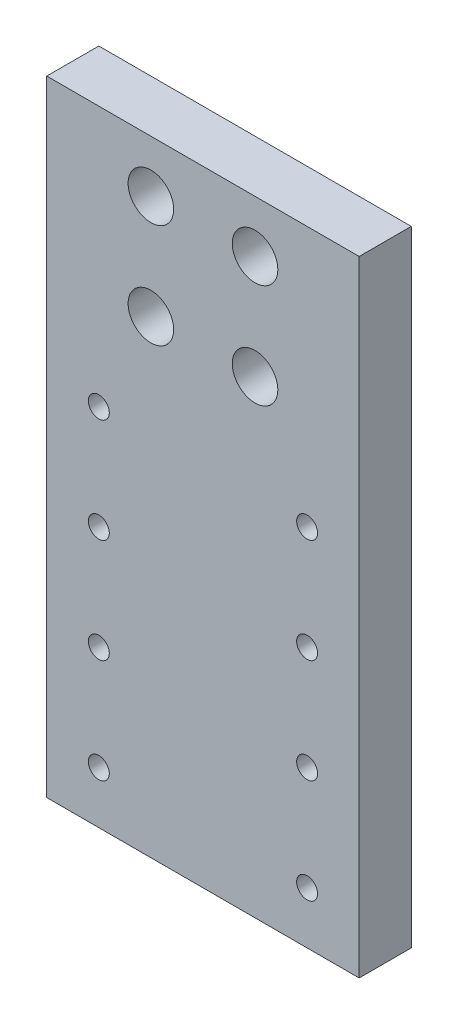
ISO-10303-21;
HEADER;
FILE_DESCRIPTION(('STEP AP214'),'2;1');
FILE_NAME('part.step','',(''),(''),'','','');
FILE_SCHEMA(('AUTOMOTIVE_DESIGN { 1 0 10303 214 1 1 1 1 }'));
ENDSEC;
DATA;
#1=APPLICATION_CONTEXT('core data for automotive mechanical design processes');
#2=APPLICATION_PROTOCOL_DEFINITION('international standard','automotive_design',2000,#1);
#3=PRODUCT_CONTEXT('',#1,'mechanical');
#4=PRODUCT('Part','Part','',(#3));
#5=PRODUCT_RELATED_PRODUCT_CATEGORY('part','',(#4));
#6=PRODUCT_DEFINITION_FORMATION('','',#4);
#7=PRODUCT_DEFINITION_CONTEXT('part definition',#1,'design');
#8=PRODUCT_DEFINITION('design','',#6,#7);
#9=PRODUCT_DEFINITION_SHAPE('','',#8);
#10=(LENGTH_UNIT() NAMED_UNIT(*) SI_UNIT(.MILLI.,.METRE.));
#11=(NAMED_UNIT(*) PLANE_ANGLE_UNIT() SI_UNIT($,.RADIAN.));
#12=(NAMED_UNIT(*) SI_UNIT($,.STERADIAN.) SOLID_ANGLE_UNIT());
#13=UNCERTAINTY_MEASURE_WITH_UNIT(LENGTH_MEASURE(1.E-05),#10,'distance_accuracy_value','');
#14=(GEOMETRIC_REPRESENTATION_CONTEXT(3) GLOBAL_UNCERTAINTY_ASSIGNED_CONTEXT((#13)) GLOBAL_UNIT_ASSIGNED_CONTEXT((#10,
#11,#12)) REPRESENTATION_CONTEXT('',''));
#15=CARTESIAN_POINT('',(0.,0.,0.));
#16=DIRECTION('',(0.,0.,1.));
#17=DIRECTION('',(1.,0.,0.));
#18=AXIS2_PLACEMENT_3D('',#15,#16,#17);
#19=CARTESIAN_POINT('',(38.1000000000001,-127.,12.7));
#20=DIRECTION('',(-1.,0.,0.));
#21=DIRECTION('',(0.,-1.,0.));
#22=AXIS2_PLACEMENT_3D('',#19,#20,#21);
#23=PLANE('',#22);
#24=DIRECTION('',(0.,1.,0.));
#25=VECTOR('',#24,1.);
#26=CARTESIAN_POINT('',(38.1000000000001,-127.,0.));
#27=LINE('',#26,#25);
#28=CARTESIAN_POINT('',(38.1000000000001,-127.,0.));
#29=VERTEX_POINT('',#28);
#30=CARTESIAN_POINT('',(38.1,25.4,0.));
#31=VERTEX_POINT('',#30);
#32=EDGE_CURVE('E95',#29,#31,#27,.T.);
#33=ORIENTED_EDGE('',*,*,#32,.T.);
#34=DIRECTION('',(0.,0.,-1.));
#35=VECTOR('',#34,1.);
#36=CARTESIAN_POINT('',(38.1,25.4,12.7));
#37=LINE('',#36,#35);
#38=CARTESIAN_POINT('',(38.1,25.4,12.7));
#39=VERTEX_POINT('',#38);
#40=EDGE_CURVE('E11',#39,#31,#37,.T.);
#41=ORIENTED_EDGE('',*,*,#40,.F.);
#42=DIRECTION('',(0.,1.,0.));
#43=VECTOR('',#42,1.);
#44=CARTESIAN_POINT('',(38.1000000000001,-127.,12.7));
#45=LINE('',#44,#43);
#46=CARTESIAN_POINT('',(38.1000000000001,-127.,12.7));
#47=VERTEX_POINT('',#46);
#48=EDGE_CURVE('E83',#47,#39,#45,.T.);
#49=ORIENTED_EDGE('',*,*,#48,.F.);
#50=DIRECTION('',(0.,0.,-1.));
#51=VECTOR('',#50,1.);
#52=CARTESIAN_POINT('',(38.1000000000001,-127.,12.7));
#53=LINE('',#52,#51);
#54=EDGE_CURVE('E91',#47,#29,#53,.T.);
#55=ORIENTED_EDGE('',*,*,#54,.T.);
#56=EDGE_LOOP('',(#33,#41,#49,#55));
#57=FACE_BOUND('',#56,.T.);
#58=ADVANCED_FACE('F32',(#57),#23,.F.);
#59=CARTESIAN_POINT('',(-38.1,25.4,12.7));
#60=DIRECTION('',(0.,-1.,0.));
#61=DIRECTION('',(1.,0.,0.));
#62=AXIS2_PLACEMENT_3D('',#59,#60,#61);
#63=PLANE('',#62);
#64=DIRECTION('',(-1.,0.,0.));
#65=VECTOR('',#64,1.);
#66=CARTESIAN_POINT('',(-38.1,25.4,0.));
#67=LINE('',#66,#65);
#68=CARTESIAN_POINT('',(-38.1,25.4,0.));
#69=VERTEX_POINT('',#68);
#70=EDGE_CURVE('E87',#31,#69,#67,.T.);
#71=ORIENTED_EDGE('',*,*,#70,.T.);
#72=DIRECTION('',(0.,0.,-1.));
#73=VECTOR('',#72,1.);
#74=CARTESIAN_POINT('',(-38.1,25.4,12.7));
#75=LINE('',#74,#73);
#76=CARTESIAN_POINT('',(-38.1,25.4,12.7));
#77=VERTEX_POINT('',#76);
#78=EDGE_CURVE('E40',#77,#69,#75,.T.);
#79=ORIENTED_EDGE('',*,*,#78,.F.);
#80=DIRECTION('',(-1.,0.,0.));
#81=VECTOR('',#80,1.);
#82=CARTESIAN_POINT('',(-38.1,25.4,12.7));
#83=LINE('',#82,#81);
#84=EDGE_CURVE('E78',#39,#77,#83,.T.);
#85=ORIENTED_EDGE('',*,*,#84,.F.);
#86=ORIENTED_EDGE('',*,*,#40,.T.);
#87=EDGE_LOOP('',(#71,#79,#85,#86));
#88=FACE_BOUND('',#87,.T.);
#89=ADVANCED_FACE('F86',(#88),#63,.F.);
#90=CARTESIAN_POINT('',(-38.1,-127.,12.7));
#91=DIRECTION('',(1.,0.,0.));
#92=DIRECTION('',(0.,1.,0.));
#93=AXIS2_PLACEMENT_3D('',#90,#91,#92);
#94=PLANE('',#93);
#95=DIRECTION('',(0.,-1.,0.));
#96=VECTOR('',#95,1.);
#97=CARTESIAN_POINT('',(-38.1,-127.,0.));
#98=LINE('',#97,#96);
#99=CARTESIAN_POINT('',(-38.1,-127.,0.));
#100=VERTEX_POINT('',#99);
#101=EDGE_CURVE('E65',#69,#100,#98,.T.);
#102=ORIENTED_EDGE('',*,*,#101,.T.);
#103=DIRECTION('',(0.,0.,-1.));
#104=VECTOR('',#103,1.);
#105=CARTESIAN_POINT('',(-38.1,-127.,12.7));
#106=LINE('',#105,#104);
#107=CARTESIAN_POINT('',(-38.1,-127.,12.7));
#108=VERTEX_POINT('',#107);
#109=EDGE_CURVE('E88',#108,#100,#106,.T.);
#110=ORIENTED_EDGE('',*,*,#109,.F.);
#111=DIRECTION('',(0.,-1.,0.));
#112=VECTOR('',#111,1.);
#113=CARTESIAN_POINT('',(-38.1,-127.,12.7));
#114=LINE('',#113,#112);
#115=EDGE_CURVE('E81',#77,#108,#114,.T.);
#116=ORIENTED_EDGE('',*,*,#115,.F.);
#117=ORIENTED_EDGE('',*,*,#78,.T.);
#118=EDGE_LOOP('',(#102,#110,#116,#117));
#119=FACE_BOUND('',#118,.T.);
#120=ADVANCED_FACE('F89',(#119),#94,.F.);
#121=CARTESIAN_POINT('',(-38.1,-127.,12.7));
#122=DIRECTION('',(0.,1.,0.));
#123=DIRECTION('',(-1.,0.,0.));
#124=AXIS2_PLACEMENT_3D('',#121,#122,#123);
#125=PLANE('',#124);
#126=DIRECTION('',(1.,0.,0.));
#127=VECTOR('',#126,1.);
#128=CARTESIAN_POINT('',(-38.1,-127.,0.));
#129=LINE('',#128,#127);
#130=EDGE_CURVE('E71',#100,#29,#129,.T.);
#131=ORIENTED_EDGE('',*,*,#130,.T.);
#132=ORIENTED_EDGE('',*,*,#54,.F.);
#133=DIRECTION('',(1.,0.,0.));
#134=VECTOR('',#133,1.);
#135=CARTESIAN_POINT('',(-38.1,-127.,12.7));
#136=LINE('',#135,#134);
#137=EDGE_CURVE('E48',#108,#47,#136,.T.);
#138=ORIENTED_EDGE('',*,*,#137,.F.);
#139=ORIENTED_EDGE('',*,*,#109,.T.);
#140=EDGE_LOOP('',(#131,#132,#138,#139));
#141=FACE_BOUND('',#140,.T.);
#142=ADVANCED_FACE('F103',(#141),#125,.F.);
#143=CARTESIAN_POINT('',(0.,0.,12.7));
#144=DIRECTION('',(0.,0.,-1.));
#145=DIRECTION('',(-1.,0.,0.));
#146=AXIS2_PLACEMENT_3D('',#143,#144,#145);
#147=PLANE('',#146);
#148=CARTESIAN_POINT('',(25.4000000000001,-114.3,12.7));
#149=DIRECTION('',(0.,0.,-1.));
#150=DIRECTION('',(-1.,0.,0.));
#151=AXIS2_PLACEMENT_3D('',#148,#149,#150);
#152=CIRCLE('',#151,2.55270000000001);
#153=CARTESIAN_POINT('',(22.8473000000001,-114.3,12.7));
#154=VERTEX_POINT('',#153);
#155=EDGE_CURVE('E240',#154,#154,#152,.T.);
#156=ORIENTED_EDGE('',*,*,#155,.T.);
#157=EDGE_LOOP('',(#156));
#158=FACE_BOUND('',#157,.T.);
#159=CARTESIAN_POINT('',(-25.3999999999999,-114.3,12.7));
#160=DIRECTION('',(0.,0.,-1.));
#161=DIRECTION('',(-1.,0.,0.));
#162=AXIS2_PLACEMENT_3D('',#159,#160,#161);
#163=CIRCLE('',#162,2.55270000000001);
#164=CARTESIAN_POINT('',(-27.9526999999999,-114.3,12.7));
#165=VERTEX_POINT('',#164);
#166=EDGE_CURVE('E228',#165,#165,#163,.T.);
#167=ORIENTED_EDGE('',*,*,#166,.T.);
#168=EDGE_LOOP('',(#167));
#169=FACE_BOUND('',#168,.T.);
#170=CARTESIAN_POINT('',(-25.3999999999998,-88.9,12.7));
#171=DIRECTION('',(0.,0.,-1.));
#172=DIRECTION('',(-1.,0.,0.));
#173=AXIS2_PLACEMENT_3D('',#170,#171,#172);
#174=CIRCLE('',#173,2.55270000000001);
#175=CARTESIAN_POINT('',(-27.9526999999998,-88.9,12.7));
#176=VERTEX_POINT('',#175);
#177=EDGE_CURVE('E216',#176,#176,#174,.T.);
#178=ORIENTED_EDGE('',*,*,#177,.T.);
#179=EDGE_LOOP('',(#178));
#180=FACE_BOUND('',#179,.T.);
#181=CARTESIAN_POINT('',(-25.3999999999997,-63.5,12.7));
#182=DIRECTION('',(0.,0.,-1.));
#183=DIRECTION('',(-1.,0.,0.));
#184=AXIS2_PLACEMENT_3D('',#181,#182,#183);
#185=CIRCLE('',#184,2.55270000000001);
#186=CARTESIAN_POINT('',(-27.9526999999997,-63.5,12.7));
#187=VERTEX_POINT('',#186);
#188=EDGE_CURVE('E204',#187,#187,#185,.T.);
#189=ORIENTED_EDGE('',*,*,#188,.T.);
#190=EDGE_LOOP('',(#189));
#191=FACE_BOUND('',#190,.T.);
#192=CARTESIAN_POINT('',(-25.3999999999997,-38.1,12.7));
#193=DIRECTION('',(0.,0.,-1.));
#194=DIRECTION('',(-1.,0.,0.));
#195=AXIS2_PLACEMENT_3D('',#192,#193,#194);
#196=CIRCLE('',#195,2.55270000000001);
#197=CARTESIAN_POINT('',(-27.9526999999997,-38.1,12.7));
#198=VERTEX_POINT('',#197);
#199=EDGE_CURVE('E192',#198,#198,#196,.T.);
#200=ORIENTED_EDGE('',*,*,#199,.T.);
#201=EDGE_LOOP('',(#200));
#202=FACE_BOUND('',#201,.T.);
#203=CARTESIAN_POINT('',(25.4000000000002,-88.9,12.7));
#204=DIRECTION('',(0.,0.,-1.));
#205=DIRECTION('',(-1.,0.,0.));
#206=AXIS2_PLACEMENT_3D('',#203,#204,#205);
#207=CIRCLE('',#206,2.55270000000001);
#208=CARTESIAN_POINT('',(22.8473000000002,-88.9,12.7));
#209=VERTEX_POINT('',#208);
#210=EDGE_CURVE('E180',#209,#209,#207,.T.);
#211=ORIENTED_EDGE('',*,*,#210,.T.);
#212=EDGE_LOOP('',(#211));
#213=FACE_BOUND('',#212,.T.);
#214=CARTESIAN_POINT('',(25.4000000000003,-63.5,12.7));
#215=DIRECTION('',(0.,0.,-1.));
#216=DIRECTION('',(-1.,0.,0.));
#217=AXIS2_PLACEMENT_3D('',#214,#215,#216);
#218=CIRCLE('',#217,2.55270000000001);
#219=CARTESIAN_POINT('',(22.8473000000002,-63.5,12.7));
#220=VERTEX_POINT('',#219);
#221=EDGE_CURVE('E168',#220,#220,#218,.T.);
#222=ORIENTED_EDGE('',*,*,#221,.T.);
#223=EDGE_LOOP('',(#222));
#224=FACE_BOUND('',#223,.T.);
#225=CARTESIAN_POINT('',(25.4000000000004,-38.1,12.7));
#226=DIRECTION('',(0.,0.,-1.));
#227=DIRECTION('',(-1.,0.,0.));
#228=AXIS2_PLACEMENT_3D('',#225,#226,#227);
#229=CIRCLE('',#228,2.55270000000001);
#230=CARTESIAN_POINT('',(22.8473000000003,-38.1,12.7));
#231=VERTEX_POINT('',#230);
#232=EDGE_CURVE('E156',#231,#231,#229,.T.);
#233=ORIENTED_EDGE('',*,*,#232,.T.);
#234=EDGE_LOOP('',(#233));
#235=FACE_BOUND('',#234,.T.);
#236=CARTESIAN_POINT('',(-12.7,12.7,12.7));
#237=DIRECTION('',(0.,0.,1.));
#238=DIRECTION('',(1.,0.,0.));
#239=AXIS2_PLACEMENT_3D('',#236,#237,#238);
#240=CIRCLE('',#239,5.55625);
#241=CARTESIAN_POINT('',(-7.14375,12.7,12.7));
#242=VERTEX_POINT('',#241);
#243=EDGE_CURVE('E153',#242,#242,#240,.T.);
#244=ORIENTED_EDGE('',*,*,#243,.F.);
#245=EDGE_LOOP('',(#244));
#246=FACE_BOUND('',#245,.T.);
#247=CARTESIAN_POINT('',(-12.7,-12.7,12.7));
#248=DIRECTION('',(0.,0.,1.));
#249=DIRECTION('',(1.,0.,0.));
#250=AXIS2_PLACEMENT_3D('',#247,#248,#249);
#251=CIRCLE('',#250,5.55625);
#252=CARTESIAN_POINT('',(-7.14375,-12.7,12.7));
#253=VERTEX_POINT('',#252);
#254=EDGE_CURVE('E141',#253,#253,#251,.T.);
#255=ORIENTED_EDGE('',*,*,#254,.F.);
#256=EDGE_LOOP('',(#255));
#257=FACE_BOUND('',#256,.T.);
#258=CARTESIAN_POINT('',(12.7,-12.7,12.7));
#259=DIRECTION('',(0.,0.,1.));
#260=DIRECTION('',(1.,0.,0.));
#261=AXIS2_PLACEMENT_3D('',#258,#259,#260);
#262=CIRCLE('',#261,5.55625);
#263=CARTESIAN_POINT('',(18.25625,-12.7,12.7));
#264=VERTEX_POINT('',#263);
#265=EDGE_CURVE('E129',#264,#264,#262,.T.);
#266=ORIENTED_EDGE('',*,*,#265,.F.);
#267=EDGE_LOOP('',(#266));
#268=FACE_BOUND('',#267,.T.);
#269=CARTESIAN_POINT('',(12.7,12.7,12.7));
#270=DIRECTION('',(0.,0.,1.));
#271=DIRECTION('',(1.,0.,0.));
#272=AXIS2_PLACEMENT_3D('',#269,#270,#271);
#273=CIRCLE('',#272,5.55625);
#274=CARTESIAN_POINT('',(18.25625,12.7,12.7));
#275=VERTEX_POINT('',#274);
#276=EDGE_CURVE('E117',#275,#275,#273,.T.);
#277=ORIENTED_EDGE('',*,*,#276,.F.);
#278=EDGE_LOOP('',(#277));
#279=FACE_BOUND('',#278,.T.);
#280=ORIENTED_EDGE('',*,*,#48,.T.);
#281=ORIENTED_EDGE('',*,*,#84,.T.);
#282=ORIENTED_EDGE('',*,*,#115,.T.);
#283=ORIENTED_EDGE('',*,*,#137,.T.);
#284=EDGE_LOOP('',(#280,#281,#282,#283));
#285=FACE_BOUND('',#284,.T.);
#286=ADVANCED_FACE('F79',(#158,#169,#180,#191,#202,#213,#224,#235,#246,#257,#268,#279,#285),
#147,.F.);
#287=CARTESIAN_POINT('',(0.,0.,0.));
#288=DIRECTION('',(0.,0.,-1.));
#289=DIRECTION('',(-1.,0.,0.));
#290=AXIS2_PLACEMENT_3D('',#287,#288,#289);
#291=PLANE('',#290);
#292=CARTESIAN_POINT('',(25.4000000000001,-114.3,0.));
#293=DIRECTION('',(0.,0.,-1.));
#294=DIRECTION('',(-1.,0.,0.));
#295=AXIS2_PLACEMENT_3D('',#292,#293,#294);
#296=CIRCLE('',#295,4.7625);
#297=CARTESIAN_POINT('',(20.6375000000001,-114.3,0.));
#298=VERTEX_POINT('',#297);
#299=EDGE_CURVE('E249',#298,#298,#296,.T.);
#300=ORIENTED_EDGE('',*,*,#299,.F.);
#301=EDGE_LOOP('',(#300));
#302=FACE_BOUND('',#301,.T.);
#303=CARTESIAN_POINT('',(-25.3999999999999,-114.3,0.));
#304=DIRECTION('',(0.,0.,-1.));
#305=DIRECTION('',(-1.,0.,0.));
#306=AXIS2_PLACEMENT_3D('',#303,#304,#305);
#307=CIRCLE('',#306,4.7625);
#308=CARTESIAN_POINT('',(-30.1624999999999,-114.3,0.));
#309=VERTEX_POINT('',#308);
#310=EDGE_CURVE('E237',#309,#309,#307,.T.);
#311=ORIENTED_EDGE('',*,*,#310,.F.);
#312=EDGE_LOOP('',(#311));
#313=FACE_BOUND('',#312,.T.);
#314=CARTESIAN_POINT('',(-25.3999999999998,-88.9,0.));
#315=DIRECTION('',(0.,0.,-1.));
#316=DIRECTION('',(-1.,0.,0.));
#317=AXIS2_PLACEMENT_3D('',#314,#315,#316);
#318=CIRCLE('',#317,4.7625);
#319=CARTESIAN_POINT('',(-30.1624999999998,-88.9,0.));
#320=VERTEX_POINT('',#319);
#321=EDGE_CURVE('E225',#320,#320,#318,.T.);
#322=ORIENTED_EDGE('',*,*,#321,.F.);
#323=EDGE_LOOP('',(#322));
#324=FACE_BOUND('',#323,.T.);
#325=CARTESIAN_POINT('',(-25.3999999999997,-63.5,0.));
#326=DIRECTION('',(0.,0.,-1.));
#327=DIRECTION('',(-1.,0.,0.));
#328=AXIS2_PLACEMENT_3D('',#325,#326,#327);
#329=CIRCLE('',#328,4.7625);
#330=CARTESIAN_POINT('',(-30.1624999999997,-63.5,0.));
#331=VERTEX_POINT('',#330);
#332=EDGE_CURVE('E213',#331,#331,#329,.T.);
#333=ORIENTED_EDGE('',*,*,#332,.F.);
#334=EDGE_LOOP('',(#333));
#335=FACE_BOUND('',#334,.T.);
#336=CARTESIAN_POINT('',(-25.3999999999997,-38.1,0.));
#337=DIRECTION('',(0.,0.,-1.));
#338=DIRECTION('',(-1.,0.,0.));
#339=AXIS2_PLACEMENT_3D('',#336,#337,#338);
#340=CIRCLE('',#339,4.7625);
#341=CARTESIAN_POINT('',(-30.1624999999996,-38.1,0.));
#342=VERTEX_POINT('',#341);
#343=EDGE_CURVE('E201',#342,#342,#340,.T.);
#344=ORIENTED_EDGE('',*,*,#343,.F.);
#345=EDGE_LOOP('',(#344));
#346=FACE_BOUND('',#345,.T.);
#347=CARTESIAN_POINT('',(25.4000000000002,-88.9,0.));
#348=DIRECTION('',(0.,0.,-1.));
#349=DIRECTION('',(-1.,0.,0.));
#350=AXIS2_PLACEMENT_3D('',#347,#348,#349);
#351=CIRCLE('',#350,4.7625);
#352=CARTESIAN_POINT('',(20.6375000000002,-88.9,0.));
#353=VERTEX_POINT('',#352);
#354=EDGE_CURVE('E189',#353,#353,#351,.T.);
#355=ORIENTED_EDGE('',*,*,#354,.F.);
#356=EDGE_LOOP('',(#355));
#357=FACE_BOUND('',#356,.T.);
#358=CARTESIAN_POINT('',(25.4000000000003,-63.5,0.));
#359=DIRECTION('',(0.,0.,-1.));
#360=DIRECTION('',(-1.,0.,0.));
#361=AXIS2_PLACEMENT_3D('',#358,#359,#360);
#362=CIRCLE('',#361,4.7625);
#363=CARTESIAN_POINT('',(20.6375000000003,-63.5,0.));
#364=VERTEX_POINT('',#363);
#365=EDGE_CURVE('E177',#364,#364,#362,.T.);
#366=ORIENTED_EDGE('',*,*,#365,.F.);
#367=EDGE_LOOP('',(#366));
#368=FACE_BOUND('',#367,.T.);
#369=CARTESIAN_POINT('',(25.4000000000004,-38.1,0.));
#370=DIRECTION('',(0.,0.,-1.));
#371=DIRECTION('',(-1.,0.,0.));
#372=AXIS2_PLACEMENT_3D('',#369,#370,#371);
#373=CIRCLE('',#372,4.7625);
#374=CARTESIAN_POINT('',(20.6375000000004,-38.1,0.));
#375=VERTEX_POINT('',#374);
#376=EDGE_CURVE('E165',#375,#375,#373,.T.);
#377=ORIENTED_EDGE('',*,*,#376,.F.);
#378=EDGE_LOOP('',(#377));
#379=FACE_BOUND('',#378,.T.);
#380=CARTESIAN_POINT('',(-12.7,12.7,0.));
#381=DIRECTION('',(0.,0.,1.));
#382=DIRECTION('',(1.,0.,0.));
#383=AXIS2_PLACEMENT_3D('',#380,#381,#382);
#384=CIRCLE('',#383,3.37820000000001);
#385=CARTESIAN_POINT('',(-9.32179999999999,12.7,0.));
#386=VERTEX_POINT('',#385);
#387=EDGE_CURVE('E144',#386,#386,#384,.T.);
#388=ORIENTED_EDGE('',*,*,#387,.T.);
#389=EDGE_LOOP('',(#388));
#390=FACE_BOUND('',#389,.T.);
#391=CARTESIAN_POINT('',(-12.7,-12.7,0.));
#392=DIRECTION('',(0.,0.,1.));
#393=DIRECTION('',(1.,0.,0.));
#394=AXIS2_PLACEMENT_3D('',#391,#392,#393);
#395=CIRCLE('',#394,3.37820000000001);
#396=CARTESIAN_POINT('',(-9.32179999999999,-12.7,0.));
#397=VERTEX_POINT('',#396);
#398=EDGE_CURVE('E132',#397,#397,#395,.T.);
#399=ORIENTED_EDGE('',*,*,#398,.T.);
#400=EDGE_LOOP('',(#399));
#401=FACE_BOUND('',#400,.T.);
#402=CARTESIAN_POINT('',(12.7,-12.7,0.));
#403=DIRECTION('',(0.,0.,1.));
#404=DIRECTION('',(1.,0.,0.));
#405=AXIS2_PLACEMENT_3D('',#402,#403,#404);
#406=CIRCLE('',#405,3.37820000000001);
#407=CARTESIAN_POINT('',(16.0782,-12.7,0.));
#408=VERTEX_POINT('',#407);
#409=EDGE_CURVE('E120',#408,#408,#406,.T.);
#410=ORIENTED_EDGE('',*,*,#409,.T.);
#411=EDGE_LOOP('',(#410));
#412=FACE_BOUND('',#411,.T.);
#413=CARTESIAN_POINT('',(12.7,12.7,0.));
#414=DIRECTION('',(0.,0.,1.));
#415=DIRECTION('',(1.,0.,0.));
#416=AXIS2_PLACEMENT_3D('',#413,#414,#415);
#417=CIRCLE('',#416,3.37820000000001);
#418=CARTESIAN_POINT('',(16.0782,12.7,0.));
#419=VERTEX_POINT('',#418);
#420=EDGE_CURVE('E98',#419,#419,#417,.T.);
#421=ORIENTED_EDGE('',*,*,#420,.T.);
#422=EDGE_LOOP('',(#421));
#423=FACE_BOUND('',#422,.T.);
#424=ORIENTED_EDGE('',*,*,#32,.F.);
#425=ORIENTED_EDGE('',*,*,#130,.F.);
#426=ORIENTED_EDGE('',*,*,#101,.F.);
#427=ORIENTED_EDGE('',*,*,#70,.F.);
#428=EDGE_LOOP('',(#424,#425,#426,#427));
#429=FACE_BOUND('',#428,.T.);
#430=ADVANCED_FACE('F106',(#302,#313,#324,#335,#346,#357,#368,#379,#390,#401,#412,#423,#429),
#291,.T.);
#431=CARTESIAN_POINT('',(12.7,12.7,12.7));
#432=DIRECTION('',(0.,0.,1.));
#433=DIRECTION('',(1.,0.,0.));
#434=AXIS2_PLACEMENT_3D('',#431,#432,#433);
#435=CYLINDRICAL_SURFACE('',#434,3.3782);
#436=ORIENTED_EDGE('',*,*,#420,.F.);
#437=EDGE_LOOP('',(#436));
#438=FACE_BOUND('',#437,.T.);
#439=CARTESIAN_POINT('',(12.7,12.7,3.81));
#440=DIRECTION('',(0.,0.,1.));
#441=DIRECTION('',(1.,0.,0.));
#442=AXIS2_PLACEMENT_3D('',#439,#440,#441);
#443=CIRCLE('',#442,3.3782);
#444=CARTESIAN_POINT('',(16.0782,12.7,3.81));
#445=VERTEX_POINT('',#444);
#446=EDGE_CURVE('E111',#445,#445,#443,.T.);
#447=ORIENTED_EDGE('',*,*,#446,.T.);
#448=EDGE_LOOP('',(#447));
#449=FACE_BOUND('',#448,.T.);
#450=ADVANCED_FACE('F257',(#438,#449),#435,.F.);
#451=CARTESIAN_POINT('',(16.0782,12.7,3.81));
#452=DIRECTION('',(0.,0.,-1.));
#453=DIRECTION('',(-1.,0.,0.));
#454=AXIS2_PLACEMENT_3D('',#451,#452,#453);
#455=PLANE('',#454);
#456=ORIENTED_EDGE('',*,*,#446,.F.);
#457=EDGE_LOOP('',(#456));
#458=FACE_BOUND('',#457,.T.);
#459=CARTESIAN_POINT('',(12.7,12.7,3.81));
#460=DIRECTION('',(0.,0.,1.));
#461=DIRECTION('',(1.,0.,0.));
#462=AXIS2_PLACEMENT_3D('',#459,#460,#461);
#463=CIRCLE('',#462,5.55625);
#464=CARTESIAN_POINT('',(18.25625,12.7,3.81));
#465=VERTEX_POINT('',#464);
#466=EDGE_CURVE('E114',#465,#465,#463,.T.);
#467=ORIENTED_EDGE('',*,*,#466,.T.);
#468=EDGE_LOOP('',(#467));
#469=FACE_BOUND('',#468,.T.);
#470=ADVANCED_FACE('F283',(#458,#469),#455,.F.);
#471=CARTESIAN_POINT('',(12.7,12.7,12.7));
#472=DIRECTION('',(0.,0.,1.));
#473=DIRECTION('',(1.,0.,0.));
#474=AXIS2_PLACEMENT_3D('',#471,#472,#473);
#475=CYLINDRICAL_SURFACE('',#474,5.55625);
#476=ORIENTED_EDGE('',*,*,#466,.F.);
#477=EDGE_LOOP('',(#476));
#478=FACE_BOUND('',#477,.T.);
#479=ORIENTED_EDGE('',*,*,#276,.T.);
#480=EDGE_LOOP('',(#479));
#481=FACE_BOUND('',#480,.T.);
#482=ADVANCED_FACE('F289',(#478,#481),#475,.F.);
#483=CARTESIAN_POINT('',(12.7,-12.7,12.7));
#484=DIRECTION('',(0.,0.,1.));
#485=DIRECTION('',(1.,0.,0.));
#486=AXIS2_PLACEMENT_3D('',#483,#484,#485);
#487=CYLINDRICAL_SURFACE('',#486,3.3782);
#488=ORIENTED_EDGE('',*,*,#409,.F.);
#489=EDGE_LOOP('',(#488));
#490=FACE_BOUND('',#489,.T.);
#491=CARTESIAN_POINT('',(12.7,-12.7,3.81));
#492=DIRECTION('',(0.,0.,1.));
#493=DIRECTION('',(1.,0.,0.));
#494=AXIS2_PLACEMENT_3D('',#491,#492,#493);
#495=CIRCLE('',#494,3.3782);
#496=CARTESIAN_POINT('',(16.0782,-12.7,3.81));
#497=VERTEX_POINT('',#496);
#498=EDGE_CURVE('E123',#497,#497,#495,.T.);
#499=ORIENTED_EDGE('',*,*,#498,.T.);
#500=EDGE_LOOP('',(#499));
#501=FACE_BOUND('',#500,.T.);
#502=ADVANCED_FACE('F295',(#490,#501),#487,.F.);
#503=CARTESIAN_POINT('',(16.0782,-12.7,3.81));
#504=DIRECTION('',(0.,0.,-1.));
#505=DIRECTION('',(-1.,0.,0.));
#506=AXIS2_PLACEMENT_3D('',#503,#504,#505);
#507=PLANE('',#506);
#508=ORIENTED_EDGE('',*,*,#498,.F.);
#509=EDGE_LOOP('',(#508));
#510=FACE_BOUND('',#509,.T.);
#511=CARTESIAN_POINT('',(12.7,-12.7,3.81));
#512=DIRECTION('',(0.,0.,1.));
#513=DIRECTION('',(1.,0.,0.));
#514=AXIS2_PLACEMENT_3D('',#511,#512,#513);
#515=CIRCLE('',#514,5.55625);
#516=CARTESIAN_POINT('',(18.25625,-12.7,3.81));
#517=VERTEX_POINT('',#516);
#518=EDGE_CURVE('E126',#517,#517,#515,.T.);
#519=ORIENTED_EDGE('',*,*,#518,.T.);
#520=EDGE_LOOP('',(#519));
#521=FACE_BOUND('',#520,.T.);
#522=ADVANCED_FACE('F350',(#510,#521),#507,.F.);
#523=CARTESIAN_POINT('',(12.7,-12.7,12.7));
#524=DIRECTION('',(0.,0.,1.));
#525=DIRECTION('',(1.,0.,0.));
#526=AXIS2_PLACEMENT_3D('',#523,#524,#525);
#527=CYLINDRICAL_SURFACE('',#526,5.55625);
#528=ORIENTED_EDGE('',*,*,#518,.F.);
#529=EDGE_LOOP('',(#528));
#530=FACE_BOUND('',#529,.T.);
#531=ORIENTED_EDGE('',*,*,#265,.T.);
#532=EDGE_LOOP('',(#531));
#533=FACE_BOUND('',#532,.T.);
#534=ADVANCED_FACE('F360',(#530,#533),#527,.F.);
#535=CARTESIAN_POINT('',(-12.7,-12.7,12.7));
#536=DIRECTION('',(0.,0.,1.));
#537=DIRECTION('',(1.,0.,0.));
#538=AXIS2_PLACEMENT_3D('',#535,#536,#537);
#539=CYLINDRICAL_SURFACE('',#538,3.3782);
#540=ORIENTED_EDGE('',*,*,#398,.F.);
#541=EDGE_LOOP('',(#540));
#542=FACE_BOUND('',#541,.T.);
#543=CARTESIAN_POINT('',(-12.7,-12.7,3.81));
#544=DIRECTION('',(0.,0.,1.));
#545=DIRECTION('',(1.,0.,0.));
#546=AXIS2_PLACEMENT_3D('',#543,#544,#545);
#547=CIRCLE('',#546,3.3782);
#548=CARTESIAN_POINT('',(-9.3218,-12.7,3.81));
#549=VERTEX_POINT('',#548);
#550=EDGE_CURVE('E135',#549,#549,#547,.T.);
#551=ORIENTED_EDGE('',*,*,#550,.T.);
#552=EDGE_LOOP('',(#551));
#553=FACE_BOUND('',#552,.T.);
#554=ADVANCED_FACE('F370',(#542,#553),#539,.F.);
#555=CARTESIAN_POINT('',(-9.3218,-12.7,3.81));
#556=DIRECTION('',(0.,0.,-1.));
#557=DIRECTION('',(-1.,0.,0.));
#558=AXIS2_PLACEMENT_3D('',#555,#556,#557);
#559=PLANE('',#558);
#560=ORIENTED_EDGE('',*,*,#550,.F.);
#561=EDGE_LOOP('',(#560));
#562=FACE_BOUND('',#561,.T.);
#563=CARTESIAN_POINT('',(-12.7,-12.7,3.81));
#564=DIRECTION('',(0.,0.,1.));
#565=DIRECTION('',(1.,0.,0.));
#566=AXIS2_PLACEMENT_3D('',#563,#564,#565);
#567=CIRCLE('',#566,5.55625);
#568=CARTESIAN_POINT('',(-7.14375,-12.7,3.81));
#569=VERTEX_POINT('',#568);
#570=EDGE_CURVE('E138',#569,#569,#567,.T.);
#571=ORIENTED_EDGE('',*,*,#570,.T.);
#572=EDGE_LOOP('',(#571));
#573=FACE_BOUND('',#572,.T.);
#574=ADVANCED_FACE('F380',(#562,#573),#559,.F.);
#575=CARTESIAN_POINT('',(-12.7,-12.7,12.7));
#576=DIRECTION('',(0.,0.,1.));
#577=DIRECTION('',(1.,0.,0.));
#578=AXIS2_PLACEMENT_3D('',#575,#576,#577);
#579=CYLINDRICAL_SURFACE('',#578,5.55625);
#580=ORIENTED_EDGE('',*,*,#570,.F.);
#581=EDGE_LOOP('',(#580));
#582=FACE_BOUND('',#581,.T.);
#583=ORIENTED_EDGE('',*,*,#254,.T.);
#584=EDGE_LOOP('',(#583));
#585=FACE_BOUND('',#584,.T.);
#586=ADVANCED_FACE('F390',(#582,#585),#579,.F.);
#587=CARTESIAN_POINT('',(-12.7,12.7,12.7));
#588=DIRECTION('',(0.,0.,1.));
#589=DIRECTION('',(1.,0.,0.));
#590=AXIS2_PLACEMENT_3D('',#587,#588,#589);
#591=CYLINDRICAL_SURFACE('',#590,3.3782);
#592=ORIENTED_EDGE('',*,*,#387,.F.);
#593=EDGE_LOOP('',(#592));
#594=FACE_BOUND('',#593,.T.);
#595=CARTESIAN_POINT('',(-12.7,12.7,3.81));
#596=DIRECTION('',(0.,0.,1.));
#597=DIRECTION('',(1.,0.,0.));
#598=AXIS2_PLACEMENT_3D('',#595,#596,#597);
#599=CIRCLE('',#598,3.3782);
#600=CARTESIAN_POINT('',(-9.3218,12.7,3.81));
#601=VERTEX_POINT('',#600);
#602=EDGE_CURVE('E147',#601,#601,#599,.T.);
#603=ORIENTED_EDGE('',*,*,#602,.T.);
#604=EDGE_LOOP('',(#603));
#605=FACE_BOUND('',#604,.T.);
#606=ADVANCED_FACE('F400',(#594,#605),#591,.F.);
#607=CARTESIAN_POINT('',(-9.3218,12.7,3.81));
#608=DIRECTION('',(0.,0.,-1.));
#609=DIRECTION('',(-1.,0.,0.));
#610=AXIS2_PLACEMENT_3D('',#607,#608,#609);
#611=PLANE('',#610);
#612=ORIENTED_EDGE('',*,*,#602,.F.);
#613=EDGE_LOOP('',(#612));
#614=FACE_BOUND('',#613,.T.);
#615=CARTESIAN_POINT('',(-12.7,12.7,3.81));
#616=DIRECTION('',(0.,0.,1.));
#617=DIRECTION('',(1.,0.,0.));
#618=AXIS2_PLACEMENT_3D('',#615,#616,#617);
#619=CIRCLE('',#618,5.55625);
#620=CARTESIAN_POINT('',(-7.14375,12.7,3.81));
#621=VERTEX_POINT('',#620);
#622=EDGE_CURVE('E150',#621,#621,#619,.T.);
#623=ORIENTED_EDGE('',*,*,#622,.T.);
#624=EDGE_LOOP('',(#623));
#625=FACE_BOUND('',#624,.T.);
#626=ADVANCED_FACE('F410',(#614,#625),#611,.F.);
#627=CARTESIAN_POINT('',(-12.7,12.7,12.7));
#628=DIRECTION('',(0.,0.,1.));
#629=DIRECTION('',(1.,0.,0.));
#630=AXIS2_PLACEMENT_3D('',#627,#628,#629);
#631=CYLINDRICAL_SURFACE('',#630,5.55625);
#632=ORIENTED_EDGE('',*,*,#622,.F.);
#633=EDGE_LOOP('',(#632));
#634=FACE_BOUND('',#633,.T.);
#635=ORIENTED_EDGE('',*,*,#243,.T.);
#636=EDGE_LOOP('',(#635));
#637=FACE_BOUND('',#636,.T.);
#638=ADVANCED_FACE('F420',(#634,#637),#631,.F.);
#639=CARTESIAN_POINT('',(25.4000000000004,-38.1,0.));
#640=DIRECTION('',(0.,0.,-1.));
#641=DIRECTION('',(-1.,0.,0.));
#642=AXIS2_PLACEMENT_3D('',#639,#640,#641);
#643=CYLINDRICAL_SURFACE('',#642,2.5527);
#644=ORIENTED_EDGE('',*,*,#232,.F.);
#645=EDGE_LOOP('',(#644));
#646=FACE_BOUND('',#645,.T.);
#647=CARTESIAN_POINT('',(25.4000000000004,-38.1,7.366));
#648=DIRECTION('',(0.,0.,-1.));
#649=DIRECTION('',(-1.,0.,0.));
#650=AXIS2_PLACEMENT_3D('',#647,#648,#649);
#651=CIRCLE('',#650,2.5527);
#652=CARTESIAN_POINT('',(22.8473000000004,-38.1,7.366));
#653=VERTEX_POINT('',#652);
#654=EDGE_CURVE('E159',#653,#653,#651,.T.);
#655=ORIENTED_EDGE('',*,*,#654,.T.);
#656=EDGE_LOOP('',(#655));
#657=FACE_BOUND('',#656,.T.);
#658=ADVANCED_FACE('F429',(#646,#657),#643,.F.);
#659=CARTESIAN_POINT('',(27.9527000000003,-38.1,7.366));
#660=DIRECTION('',(0.,0.,1.));
#661=DIRECTION('',(1.,0.,0.));
#662=AXIS2_PLACEMENT_3D('',#659,#660,#661);
#663=PLANE('',#662);
#664=ORIENTED_EDGE('',*,*,#654,.F.);
#665=EDGE_LOOP('',(#664));
#666=FACE_BOUND('',#665,.T.);
#667=CARTESIAN_POINT('',(25.4000000000004,-38.1,7.366));
#668=DIRECTION('',(0.,0.,-1.));
#669=DIRECTION('',(-1.,0.,0.));
#670=AXIS2_PLACEMENT_3D('',#667,#668,#669);
#671=CIRCLE('',#670,4.7625);
#672=CARTESIAN_POINT('',(20.6375000000004,-38.1,7.366));
#673=VERTEX_POINT('',#672);
#674=EDGE_CURVE('E162',#673,#673,#671,.T.);
#675=ORIENTED_EDGE('',*,*,#674,.T.);
#676=EDGE_LOOP('',(#675));
#677=FACE_BOUND('',#676,.T.);
#678=ADVANCED_FACE('F448',(#666,#677),#663,.F.);
#679=CARTESIAN_POINT('',(25.4000000000004,-38.1,0.));
#680=DIRECTION('',(0.,0.,-1.));
#681=DIRECTION('',(-1.,0.,0.));
#682=AXIS2_PLACEMENT_3D('',#679,#680,#681);
#683=CYLINDRICAL_SURFACE('',#682,4.7625);
#684=ORIENTED_EDGE('',*,*,#674,.F.);
#685=EDGE_LOOP('',(#684));
#686=FACE_BOUND('',#685,.T.);
#687=ORIENTED_EDGE('',*,*,#376,.T.);
#688=EDGE_LOOP('',(#687));
#689=FACE_BOUND('',#688,.T.);
#690=ADVANCED_FACE('F458',(#686,#689),#683,.F.);
#691=CARTESIAN_POINT('',(25.4000000000003,-63.5,0.));
#692=DIRECTION('',(0.,0.,-1.));
#693=DIRECTION('',(-1.,0.,0.));
#694=AXIS2_PLACEMENT_3D('',#691,#692,#693);
#695=CYLINDRICAL_SURFACE('',#694,2.5527);
#696=ORIENTED_EDGE('',*,*,#221,.F.);
#697=EDGE_LOOP('',(#696));
#698=FACE_BOUND('',#697,.T.);
#699=CARTESIAN_POINT('',(25.4000000000003,-63.5,7.366));
#700=DIRECTION('',(0.,0.,-1.));
#701=DIRECTION('',(-1.,0.,0.));
#702=AXIS2_PLACEMENT_3D('',#699,#700,#701);
#703=CIRCLE('',#702,2.5527);
#704=CARTESIAN_POINT('',(22.8473000000003,-63.5,7.366));
#705=VERTEX_POINT('',#704);
#706=EDGE_CURVE('E171',#705,#705,#703,.T.);
#707=ORIENTED_EDGE('',*,*,#706,.T.);
#708=EDGE_LOOP('',(#707));
#709=FACE_BOUND('',#708,.T.);
#710=ADVANCED_FACE('F468',(#698,#709),#695,.F.);
#711=CARTESIAN_POINT('',(27.9527000000003,-63.5,7.366));
#712=DIRECTION('',(0.,0.,1.));
#713=DIRECTION('',(1.,0.,0.));
#714=AXIS2_PLACEMENT_3D('',#711,#712,#713);
#715=PLANE('',#714);
#716=ORIENTED_EDGE('',*,*,#706,.F.);
#717=EDGE_LOOP('',(#716));
#718=FACE_BOUND('',#717,.T.);
#719=CARTESIAN_POINT('',(25.4000000000003,-63.5,7.366));
#720=DIRECTION('',(0.,0.,-1.));
#721=DIRECTION('',(-1.,0.,0.));
#722=AXIS2_PLACEMENT_3D('',#719,#720,#721);
#723=CIRCLE('',#722,4.7625);
#724=CARTESIAN_POINT('',(20.6375000000003,-63.5,7.366));
#725=VERTEX_POINT('',#724);
#726=EDGE_CURVE('E174',#725,#725,#723,.T.);
#727=ORIENTED_EDGE('',*,*,#726,.T.);
#728=EDGE_LOOP('',(#727));
#729=FACE_BOUND('',#728,.T.);
#730=ADVANCED_FACE('F478',(#718,#729),#715,.F.);
#731=CARTESIAN_POINT('',(25.4000000000003,-63.5,0.));
#732=DIRECTION('',(0.,0.,-1.));
#733=DIRECTION('',(-1.,0.,0.));
#734=AXIS2_PLACEMENT_3D('',#731,#732,#733);
#735=CYLINDRICAL_SURFACE('',#734,4.7625);
#736=ORIENTED_EDGE('',*,*,#726,.F.);
#737=EDGE_LOOP('',(#736));
#738=FACE_BOUND('',#737,.T.);
#739=ORIENTED_EDGE('',*,*,#365,.T.);
#740=EDGE_LOOP('',(#739));
#741=FACE_BOUND('',#740,.T.);
#742=ADVANCED_FACE('F488',(#738,#741),#735,.F.);
#743=CARTESIAN_POINT('',(25.4000000000002,-88.9,0.));
#744=DIRECTION('',(0.,0.,-1.));
#745=DIRECTION('',(-1.,0.,0.));
#746=AXIS2_PLACEMENT_3D('',#743,#744,#745);
#747=CYLINDRICAL_SURFACE('',#746,2.5527);
#748=ORIENTED_EDGE('',*,*,#210,.F.);
#749=EDGE_LOOP('',(#748));
#750=FACE_BOUND('',#749,.T.);
#751=CARTESIAN_POINT('',(25.4000000000002,-88.9,7.366));
#752=DIRECTION('',(0.,0.,-1.));
#753=DIRECTION('',(-1.,0.,0.));
#754=AXIS2_PLACEMENT_3D('',#751,#752,#753);
#755=CIRCLE('',#754,2.5527);
#756=CARTESIAN_POINT('',(22.8473000000002,-88.9,7.366));
#757=VERTEX_POINT('',#756);
#758=EDGE_CURVE('E183',#757,#757,#755,.T.);
#759=ORIENTED_EDGE('',*,*,#758,.T.);
#760=EDGE_LOOP('',(#759));
#761=FACE_BOUND('',#760,.T.);
#762=ADVANCED_FACE('F498',(#750,#761),#747,.F.);
#763=CARTESIAN_POINT('',(27.9527000000002,-88.9,7.366));
#764=DIRECTION('',(0.,0.,1.));
#765=DIRECTION('',(1.,0.,0.));
#766=AXIS2_PLACEMENT_3D('',#763,#764,#765);
#767=PLANE('',#766);
#768=ORIENTED_EDGE('',*,*,#758,.F.);
#769=EDGE_LOOP('',(#768));
#770=FACE_BOUND('',#769,.T.);
#771=CARTESIAN_POINT('',(25.4000000000002,-88.9,7.366));
#772=DIRECTION('',(0.,0.,-1.));
#773=DIRECTION('',(-1.,0.,0.));
#774=AXIS2_PLACEMENT_3D('',#771,#772,#773);
#775=CIRCLE('',#774,4.7625);
#776=CARTESIAN_POINT('',(20.6375000000002,-88.9,7.366));
#777=VERTEX_POINT('',#776);
#778=EDGE_CURVE('E186',#777,#777,#775,.T.);
#779=ORIENTED_EDGE('',*,*,#778,.T.);
#780=EDGE_LOOP('',(#779));
#781=FACE_BOUND('',#780,.T.);
#782=ADVANCED_FACE('F508',(#770,#781),#767,.F.);
#783=CARTESIAN_POINT('',(25.4000000000002,-88.9,0.));
#784=DIRECTION('',(0.,0.,-1.));
#785=DIRECTION('',(-1.,0.,0.));
#786=AXIS2_PLACEMENT_3D('',#783,#784,#785);
#787=CYLINDRICAL_SURFACE('',#786,4.7625);
#788=ORIENTED_EDGE('',*,*,#778,.F.);
#789=EDGE_LOOP('',(#788));
#790=FACE_BOUND('',#789,.T.);
#791=ORIENTED_EDGE('',*,*,#354,.T.);
#792=EDGE_LOOP('',(#791));
#793=FACE_BOUND('',#792,.T.);
#794=ADVANCED_FACE('F518',(#790,#793),#787,.F.);
#795=CARTESIAN_POINT('',(-25.3999999999997,-38.1,0.));
#796=DIRECTION('',(0.,0.,-1.));
#797=DIRECTION('',(-1.,0.,0.));
#798=AXIS2_PLACEMENT_3D('',#795,#796,#797);
#799=CYLINDRICAL_SURFACE('',#798,2.5527);
#800=ORIENTED_EDGE('',*,*,#199,.F.);
#801=EDGE_LOOP('',(#800));
#802=FACE_BOUND('',#801,.T.);
#803=CARTESIAN_POINT('',(-25.3999999999997,-38.1,7.366));
#804=DIRECTION('',(0.,0.,-1.));
#805=DIRECTION('',(-1.,0.,0.));
#806=AXIS2_PLACEMENT_3D('',#803,#804,#805);
#807=CIRCLE('',#806,2.5527);
#808=CARTESIAN_POINT('',(-27.9526999999996,-38.1,7.366));
#809=VERTEX_POINT('',#808);
#810=EDGE_CURVE('E195',#809,#809,#807,.T.);
#811=ORIENTED_EDGE('',*,*,#810,.T.);
#812=EDGE_LOOP('',(#811));
#813=FACE_BOUND('',#812,.T.);
#814=ADVANCED_FACE('F528',(#802,#813),#799,.F.);
#815=CARTESIAN_POINT('',(-22.8472999999997,-38.1,7.366));
#816=DIRECTION('',(0.,0.,1.));
#817=DIRECTION('',(1.,0.,0.));
#818=AXIS2_PLACEMENT_3D('',#815,#816,#817);
#819=PLANE('',#818);
#820=ORIENTED_EDGE('',*,*,#810,.F.);
#821=EDGE_LOOP('',(#820));
#822=FACE_BOUND('',#821,.T.);
#823=CARTESIAN_POINT('',(-25.3999999999997,-38.1,7.366));
#824=DIRECTION('',(0.,0.,-1.));
#825=DIRECTION('',(-1.,0.,0.));
#826=AXIS2_PLACEMENT_3D('',#823,#824,#825);
#827=CIRCLE('',#826,4.7625);
#828=CARTESIAN_POINT('',(-30.1624999999996,-38.1,7.366));
#829=VERTEX_POINT('',#828);
#830=EDGE_CURVE('E198',#829,#829,#827,.T.);
#831=ORIENTED_EDGE('',*,*,#830,.T.);
#832=EDGE_LOOP('',(#831));
#833=FACE_BOUND('',#832,.T.);
#834=ADVANCED_FACE('F538',(#822,#833),#819,.F.);
#835=CARTESIAN_POINT('',(-25.3999999999997,-38.1,0.));
#836=DIRECTION('',(0.,0.,-1.));
#837=DIRECTION('',(-1.,0.,0.));
#838=AXIS2_PLACEMENT_3D('',#835,#836,#837);
#839=CYLINDRICAL_SURFACE('',#838,4.7625);
#840=ORIENTED_EDGE('',*,*,#830,.F.);
#841=EDGE_LOOP('',(#840));
#842=FACE_BOUND('',#841,.T.);
#843=ORIENTED_EDGE('',*,*,#343,.T.);
#844=EDGE_LOOP('',(#843));
#845=FACE_BOUND('',#844,.T.);
#846=ADVANCED_FACE('F548',(#842,#845),#839,.F.);
#847=CARTESIAN_POINT('',(-25.3999999999997,-63.5,0.));
#848=DIRECTION('',(0.,0.,-1.));
#849=DIRECTION('',(-1.,0.,0.));
#850=AXIS2_PLACEMENT_3D('',#847,#848,#849);
#851=CYLINDRICAL_SURFACE('',#850,2.5527);
#852=ORIENTED_EDGE('',*,*,#188,.F.);
#853=EDGE_LOOP('',(#852));
#854=FACE_BOUND('',#853,.T.);
#855=CARTESIAN_POINT('',(-25.3999999999997,-63.5,7.366));
#856=DIRECTION('',(0.,0.,-1.));
#857=DIRECTION('',(-1.,0.,0.));
#858=AXIS2_PLACEMENT_3D('',#855,#856,#857);
#859=CIRCLE('',#858,2.5527);
#860=CARTESIAN_POINT('',(-27.9526999999997,-63.5,7.366));
#861=VERTEX_POINT('',#860);
#862=EDGE_CURVE('E207',#861,#861,#859,.T.);
#863=ORIENTED_EDGE('',*,*,#862,.T.);
#864=EDGE_LOOP('',(#863));
#865=FACE_BOUND('',#864,.T.);
#866=ADVANCED_FACE('F558',(#854,#865),#851,.F.);
#867=CARTESIAN_POINT('',(-22.8472999999997,-63.5,7.366));
#868=DIRECTION('',(0.,0.,1.));
#869=DIRECTION('',(1.,0.,0.));
#870=AXIS2_PLACEMENT_3D('',#867,#868,#869);
#871=PLANE('',#870);
#872=ORIENTED_EDGE('',*,*,#862,.F.);
#873=EDGE_LOOP('',(#872));
#874=FACE_BOUND('',#873,.T.);
#875=CARTESIAN_POINT('',(-25.3999999999997,-63.5,7.366));
#876=DIRECTION('',(0.,0.,-1.));
#877=DIRECTION('',(-1.,0.,0.));
#878=AXIS2_PLACEMENT_3D('',#875,#876,#877);
#879=CIRCLE('',#878,4.7625);
#880=CARTESIAN_POINT('',(-30.1624999999997,-63.5,7.366));
#881=VERTEX_POINT('',#880);
#882=EDGE_CURVE('E210',#881,#881,#879,.T.);
#883=ORIENTED_EDGE('',*,*,#882,.T.);
#884=EDGE_LOOP('',(#883));
#885=FACE_BOUND('',#884,.T.);
#886=ADVANCED_FACE('F568',(#874,#885),#871,.F.);
#887=CARTESIAN_POINT('',(-25.3999999999997,-63.5,0.));
#888=DIRECTION('',(0.,0.,-1.));
#889=DIRECTION('',(-1.,0.,0.));
#890=AXIS2_PLACEMENT_3D('',#887,#888,#889);
#891=CYLINDRICAL_SURFACE('',#890,4.7625);
#892=ORIENTED_EDGE('',*,*,#882,.F.);
#893=EDGE_LOOP('',(#892));
#894=FACE_BOUND('',#893,.T.);
#895=ORIENTED_EDGE('',*,*,#332,.T.);
#896=EDGE_LOOP('',(#895));
#897=FACE_BOUND('',#896,.T.);
#898=ADVANCED_FACE('F578',(#894,#897),#891,.F.);
#899=CARTESIAN_POINT('',(-25.3999999999998,-88.9,0.));
#900=DIRECTION('',(0.,0.,-1.));
#901=DIRECTION('',(-1.,0.,0.));
#902=AXIS2_PLACEMENT_3D('',#899,#900,#901);
#903=CYLINDRICAL_SURFACE('',#902,2.5527);
#904=ORIENTED_EDGE('',*,*,#177,.F.);
#905=EDGE_LOOP('',(#904));
#906=FACE_BOUND('',#905,.T.);
#907=CARTESIAN_POINT('',(-25.3999999999998,-88.9,7.366));
#908=DIRECTION('',(0.,0.,-1.));
#909=DIRECTION('',(-1.,0.,0.));
#910=AXIS2_PLACEMENT_3D('',#907,#908,#909);
#911=CIRCLE('',#910,2.5527);
#912=CARTESIAN_POINT('',(-27.9526999999998,-88.9,7.366));
#913=VERTEX_POINT('',#912);
#914=EDGE_CURVE('E219',#913,#913,#911,.T.);
#915=ORIENTED_EDGE('',*,*,#914,.T.);
#916=EDGE_LOOP('',(#915));
#917=FACE_BOUND('',#916,.T.);
#918=ADVANCED_FACE('F588',(#906,#917),#903,.F.);
#919=CARTESIAN_POINT('',(-22.8472999999998,-88.9,7.366));
#920=DIRECTION('',(0.,0.,1.));
#921=DIRECTION('',(1.,0.,0.));
#922=AXIS2_PLACEMENT_3D('',#919,#920,#921);
#923=PLANE('',#922);
#924=ORIENTED_EDGE('',*,*,#914,.F.);
#925=EDGE_LOOP('',(#924));
#926=FACE_BOUND('',#925,.T.);
#927=CARTESIAN_POINT('',(-25.3999999999998,-88.9,7.366));
#928=DIRECTION('',(0.,0.,-1.));
#929=DIRECTION('',(-1.,0.,0.));
#930=AXIS2_PLACEMENT_3D('',#927,#928,#929);
#931=CIRCLE('',#930,4.7625);
#932=CARTESIAN_POINT('',(-30.1624999999998,-88.9,7.366));
#933=VERTEX_POINT('',#932);
#934=EDGE_CURVE('E222',#933,#933,#931,.T.);
#935=ORIENTED_EDGE('',*,*,#934,.T.);
#936=EDGE_LOOP('',(#935));
#937=FACE_BOUND('',#936,.T.);
#938=ADVANCED_FACE('F598',(#926,#937),#923,.F.);
#939=CARTESIAN_POINT('',(-25.3999999999998,-88.9,0.));
#940=DIRECTION('',(0.,0.,-1.));
#941=DIRECTION('',(-1.,0.,0.));
#942=AXIS2_PLACEMENT_3D('',#939,#940,#941);
#943=CYLINDRICAL_SURFACE('',#942,4.7625);
#944=ORIENTED_EDGE('',*,*,#934,.F.);
#945=EDGE_LOOP('',(#944));
#946=FACE_BOUND('',#945,.T.);
#947=ORIENTED_EDGE('',*,*,#321,.T.);
#948=EDGE_LOOP('',(#947));
#949=FACE_BOUND('',#948,.T.);
#950=ADVANCED_FACE('F608',(#946,#949),#943,.F.);
#951=CARTESIAN_POINT('',(-25.3999999999999,-114.3,0.));
#952=DIRECTION('',(0.,0.,-1.));
#953=DIRECTION('',(-1.,0.,0.));
#954=AXIS2_PLACEMENT_3D('',#951,#952,#953);
#955=CYLINDRICAL_SURFACE('',#954,2.5527);
#956=ORIENTED_EDGE('',*,*,#166,.F.);
#957=EDGE_LOOP('',(#956));
#958=FACE_BOUND('',#957,.T.);
#959=CARTESIAN_POINT('',(-25.3999999999999,-114.3,7.366));
#960=DIRECTION('',(0.,0.,-1.));
#961=DIRECTION('',(-1.,0.,0.));
#962=AXIS2_PLACEMENT_3D('',#959,#960,#961);
#963=CIRCLE('',#962,2.5527);
#964=CARTESIAN_POINT('',(-27.9526999999999,-114.3,7.366));
#965=VERTEX_POINT('',#964);
#966=EDGE_CURVE('E231',#965,#965,#963,.T.);
#967=ORIENTED_EDGE('',*,*,#966,.T.);
#968=EDGE_LOOP('',(#967));
#969=FACE_BOUND('',#968,.T.);
#970=ADVANCED_FACE('F618',(#958,#969),#955,.F.);
#971=CARTESIAN_POINT('',(-22.8472999999999,-114.3,7.366));
#972=DIRECTION('',(0.,0.,1.));
#973=DIRECTION('',(1.,0.,0.));
#974=AXIS2_PLACEMENT_3D('',#971,#972,#973);
#975=PLANE('',#974);
#976=ORIENTED_EDGE('',*,*,#966,.F.);
#977=EDGE_LOOP('',(#976));
#978=FACE_BOUND('',#977,.T.);
#979=CARTESIAN_POINT('',(-25.3999999999999,-114.3,7.366));
#980=DIRECTION('',(0.,0.,-1.));
#981=DIRECTION('',(-1.,0.,0.));
#982=AXIS2_PLACEMENT_3D('',#979,#980,#981);
#983=CIRCLE('',#982,4.7625);
#984=CARTESIAN_POINT('',(-30.1624999999999,-114.3,7.366));
#985=VERTEX_POINT('',#984);
#986=EDGE_CURVE('E234',#985,#985,#983,.T.);
#987=ORIENTED_EDGE('',*,*,#986,.T.);
#988=EDGE_LOOP('',(#987));
#989=FACE_BOUND('',#988,.T.);
#990=ADVANCED_FACE('F628',(#978,#989),#975,.F.);
#991=CARTESIAN_POINT('',(-25.3999999999999,-114.3,0.));
#992=DIRECTION('',(0.,0.,-1.));
#993=DIRECTION('',(-1.,0.,0.));
#994=AXIS2_PLACEMENT_3D('',#991,#992,#993);
#995=CYLINDRICAL_SURFACE('',#994,4.7625);
#996=ORIENTED_EDGE('',*,*,#986,.F.);
#997=EDGE_LOOP('',(#996));
#998=FACE_BOUND('',#997,.T.);
#999=ORIENTED_EDGE('',*,*,#310,.T.);
#1000=EDGE_LOOP('',(#999));
#1001=FACE_BOUND('',#1000,.T.);
#1002=ADVANCED_FACE('F638',(#998,#1001),#995,.F.);
#1003=CARTESIAN_POINT('',(25.4000000000001,-114.3,0.));
#1004=DIRECTION('',(0.,0.,-1.));
#1005=DIRECTION('',(-1.,0.,0.));
#1006=AXIS2_PLACEMENT_3D('',#1003,#1004,#1005);
#1007=CYLINDRICAL_SURFACE('',#1006,2.5527);
#1008=ORIENTED_EDGE('',*,*,#155,.F.);
#1009=EDGE_LOOP('',(#1008));
#1010=FACE_BOUND('',#1009,.T.);
#1011=CARTESIAN_POINT('',(25.4000000000001,-114.3,7.366));
#1012=DIRECTION('',(0.,0.,-1.));
#1013=DIRECTION('',(-1.,0.,0.));
#1014=AXIS2_PLACEMENT_3D('',#1011,#1012,#1013);
#1015=CIRCLE('',#1014,2.5527);
#1016=CARTESIAN_POINT('',(22.8473000000001,-114.3,7.366));
#1017=VERTEX_POINT('',#1016);
#1018=EDGE_CURVE('E243',#1017,#1017,#1015,.T.);
#1019=ORIENTED_EDGE('',*,*,#1018,.T.);
#1020=EDGE_LOOP('',(#1019));
#1021=FACE_BOUND('',#1020,.T.);
#1022=ADVANCED_FACE('F648',(#1010,#1021),#1007,.F.);
#1023=CARTESIAN_POINT('',(27.9527000000001,-114.3,7.366));
#1024=DIRECTION('',(0.,0.,1.));
#1025=DIRECTION('',(1.,0.,0.));
#1026=AXIS2_PLACEMENT_3D('',#1023,#1024,#1025);
#1027=PLANE('',#1026);
#1028=ORIENTED_EDGE('',*,*,#1018,.F.);
#1029=EDGE_LOOP('',(#1028));
#1030=FACE_BOUND('',#1029,.T.);
#1031=CARTESIAN_POINT('',(25.4000000000001,-114.3,7.366));
#1032=DIRECTION('',(0.,0.,-1.));
#1033=DIRECTION('',(-1.,0.,0.));
#1034=AXIS2_PLACEMENT_3D('',#1031,#1032,#1033);
#1035=CIRCLE('',#1034,4.7625);
#1036=CARTESIAN_POINT('',(20.6375000000001,-114.3,7.366));
#1037=VERTEX_POINT('',#1036);
#1038=EDGE_CURVE('E246',#1037,#1037,#1035,.T.);
#1039=ORIENTED_EDGE('',*,*,#1038,.T.);
#1040=EDGE_LOOP('',(#1039));
#1041=FACE_BOUND('',#1040,.T.);
#1042=ADVANCED_FACE('F658',(#1030,#1041),#1027,.F.);
#1043=CARTESIAN_POINT('',(25.4000000000001,-114.3,0.));
#1044=DIRECTION('',(0.,0.,-1.));
#1045=DIRECTION('',(-1.,0.,0.));
#1046=AXIS2_PLACEMENT_3D('',#1043,#1044,#1045);
#1047=CYLINDRICAL_SURFACE('',#1046,4.7625);
#1048=ORIENTED_EDGE('',*,*,#1038,.F.);
#1049=EDGE_LOOP('',(#1048));
#1050=FACE_BOUND('',#1049,.T.);
#1051=ORIENTED_EDGE('',*,*,#299,.T.);
#1052=EDGE_LOOP('',(#1051));
#1053=FACE_BOUND('',#1052,.T.);
#1054=ADVANCED_FACE('F253',(#1050,#1053),#1047,.F.);
#1055=CLOSED_SHELL('',(#58,#89,#120,#142,#286,#430,#450,#470,#482,#502,#522,#534,#554,#574,#586,
#606,#626,#638,#658,#678,#690,#710,#730,#742,#762,#782,#794,#814,#834,#846,#866,#886,#898,#918,
#938,#950,#970,#990,#1002,#1022,#1042,#1054));
#1056=MANIFOLD_SOLID_BREP('B2',#1055);
#1057=ADVANCED_BREP_SHAPE_REPRESENTATION('',(#18,#1056),#14);
#1058=SHAPE_DEFINITION_REPRESENTATION(#9,#1057);
ENDSEC;
END-ISO-10303-21;
